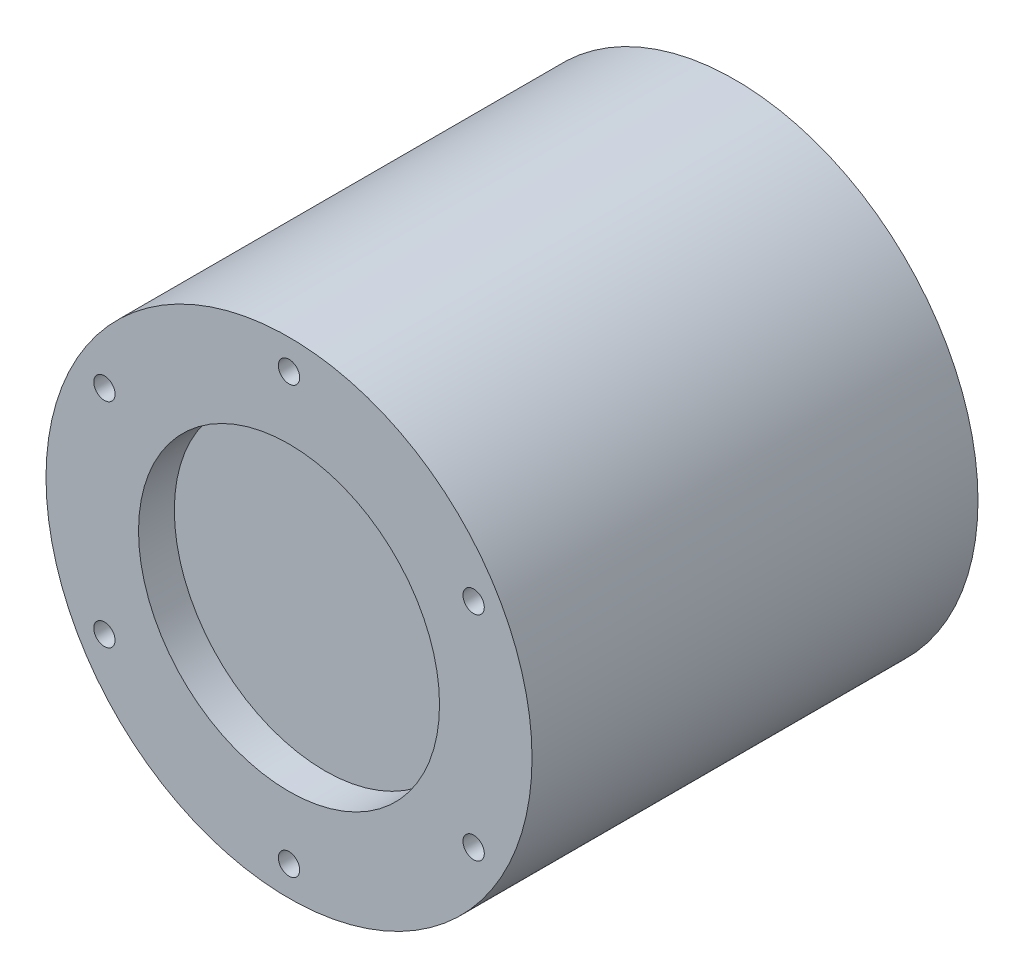
ISO-10303-21;
HEADER;
FILE_DESCRIPTION(('STEP AP214'),'2;1');
FILE_NAME('part.step','',(''),(''),'','','');
FILE_SCHEMA(('AUTOMOTIVE_DESIGN { 1 0 10303 214 1 1 1 1 }'));
ENDSEC;
DATA;
#1=APPLICATION_CONTEXT('core data for automotive mechanical design processes');
#2=APPLICATION_PROTOCOL_DEFINITION('international standard','automotive_design',2000,#1);
#3=PRODUCT_CONTEXT('',#1,'mechanical');
#4=PRODUCT('Part','Part','',(#3));
#5=PRODUCT_RELATED_PRODUCT_CATEGORY('part','',(#4));
#6=PRODUCT_DEFINITION_FORMATION('','',#4);
#7=PRODUCT_DEFINITION_CONTEXT('part definition',#1,'design');
#8=PRODUCT_DEFINITION('design','',#6,#7);
#9=PRODUCT_DEFINITION_SHAPE('','',#8);
#10=(LENGTH_UNIT() NAMED_UNIT(*) SI_UNIT(.MILLI.,.METRE.));
#11=(NAMED_UNIT(*) PLANE_ANGLE_UNIT() SI_UNIT($,.RADIAN.));
#12=(NAMED_UNIT(*) SI_UNIT($,.STERADIAN.) SOLID_ANGLE_UNIT());
#13=UNCERTAINTY_MEASURE_WITH_UNIT(LENGTH_MEASURE(1.E-05),#10,'distance_accuracy_value','');
#14=(GEOMETRIC_REPRESENTATION_CONTEXT(3) GLOBAL_UNCERTAINTY_ASSIGNED_CONTEXT((#13)) GLOBAL_UNIT_ASSIGNED_CONTEXT((#10,
#11,#12)) REPRESENTATION_CONTEXT('',''));
#15=CARTESIAN_POINT('',(0.,0.,0.));
#16=DIRECTION('',(0.,0.,1.));
#17=DIRECTION('',(1.,0.,0.));
#18=AXIS2_PLACEMENT_3D('',#15,#16,#17);
#19=CARTESIAN_POINT('',(0.,0.,-1.));
#20=DIRECTION('',(0.,0.,1.));
#21=DIRECTION('',(1.,0.,0.));
#22=AXIS2_PLACEMENT_3D('',#19,#20,#21);
#23=PLANE('',#22);
#24=CARTESIAN_POINT('',(0.,0.,-1.));
#25=DIRECTION('',(0.,0.,1.));
#26=DIRECTION('',(1.,0.,0.));
#27=AXIS2_PLACEMENT_3D('',#24,#25,#26);
#28=CIRCLE('',#27,17.65);
#29=CARTESIAN_POINT('',(-17.65,0.,-1.));
#30=VERTEX_POINT('',#29);
#31=EDGE_CURVE('E45',#30,#30,#28,.F.);
#32=ORIENTED_EDGE('',*,*,#31,.T.);
#33=EDGE_LOOP('',(#32));
#34=FACE_BOUND('',#33,.T.);
#35=CARTESIAN_POINT('',(0.,-25.,-1.));
#36=DIRECTION('',(0.,0.,1.));
#37=DIRECTION('',(1.,0.,0.));
#38=AXIS2_PLACEMENT_3D('',#35,#36,#37);
#39=CIRCLE('',#38,1.25);
#40=CARTESIAN_POINT('',(1.25,-25.,-1.));
#41=VERTEX_POINT('',#40);
#42=EDGE_CURVE('E77',#41,#41,#39,.T.);
#43=ORIENTED_EDGE('',*,*,#42,.F.);
#44=EDGE_LOOP('',(#43));
#45=FACE_BOUND('',#44,.T.);
#46=CARTESIAN_POINT('',(-21.650635094611,12.5,-1.));
#47=DIRECTION('',(0.,0.,1.));
#48=DIRECTION('',(1.,0.,0.));
#49=AXIS2_PLACEMENT_3D('',#46,#47,#48);
#50=CIRCLE('',#49,1.25);
#51=CARTESIAN_POINT('',(-20.400635094611,12.5,-1.));
#52=VERTEX_POINT('',#51);
#53=EDGE_CURVE('E65',#52,#52,#50,.T.);
#54=ORIENTED_EDGE('',*,*,#53,.F.);
#55=EDGE_LOOP('',(#54));
#56=FACE_BOUND('',#55,.T.);
#57=CARTESIAN_POINT('',(21.650635094611,12.5,-1.));
#58=DIRECTION('',(0.,0.,1.));
#59=DIRECTION('',(1.,0.,0.));
#60=AXIS2_PLACEMENT_3D('',#57,#58,#59);
#61=CIRCLE('',#60,1.25);
#62=CARTESIAN_POINT('',(22.900635094611,12.5,-1.));
#63=VERTEX_POINT('',#62);
#64=EDGE_CURVE('E54',#63,#63,#61,.T.);
#65=ORIENTED_EDGE('',*,*,#64,.F.);
#66=EDGE_LOOP('',(#65));
#67=FACE_BOUND('',#66,.T.);
#68=CARTESIAN_POINT('',(0.,0.,-1.));
#69=DIRECTION('',(0.,0.,1.));
#70=DIRECTION('',(1.,0.,0.));
#71=AXIS2_PLACEMENT_3D('',#68,#69,#70);
#72=CIRCLE('',#71,28.5);
#73=CARTESIAN_POINT('',(28.5,0.,-1.));
#74=VERTEX_POINT('',#73);
#75=EDGE_CURVE('E10',#74,#74,#72,.T.);
#76=ORIENTED_EDGE('',*,*,#75,.T.);
#77=EDGE_LOOP('',(#76));
#78=FACE_BOUND('',#77,.T.);
#79=CARTESIAN_POINT('',(0.,25.,-1.));
#80=DIRECTION('',(0.,0.,1.));
#81=DIRECTION('',(1.,0.,0.));
#82=AXIS2_PLACEMENT_3D('',#79,#80,#81);
#83=CIRCLE('',#82,1.25);
#84=CARTESIAN_POINT('',(1.25,25.,-1.));
#85=VERTEX_POINT('',#84);
#86=EDGE_CURVE('E59',#85,#85,#83,.T.);
#87=ORIENTED_EDGE('',*,*,#86,.F.);
#88=EDGE_LOOP('',(#87));
#89=FACE_BOUND('',#88,.T.);
#90=CARTESIAN_POINT('',(-21.650635094611,-12.5,-1.));
#91=DIRECTION('',(0.,0.,1.));
#92=DIRECTION('',(1.,0.,0.));
#93=AXIS2_PLACEMENT_3D('',#90,#91,#92);
#94=CIRCLE('',#93,1.25);
#95=CARTESIAN_POINT('',(-20.400635094611,-12.5,-1.));
#96=VERTEX_POINT('',#95);
#97=EDGE_CURVE('E71',#96,#96,#94,.T.);
#98=ORIENTED_EDGE('',*,*,#97,.F.);
#99=EDGE_LOOP('',(#98));
#100=FACE_BOUND('',#99,.T.);
#101=CARTESIAN_POINT('',(21.650635094611,-12.5,-1.));
#102=DIRECTION('',(0.,0.,1.));
#103=DIRECTION('',(1.,0.,0.));
#104=AXIS2_PLACEMENT_3D('',#101,#102,#103);
#105=CIRCLE('',#104,1.25);
#106=CARTESIAN_POINT('',(22.900635094611,-12.5,-1.));
#107=VERTEX_POINT('',#106);
#108=EDGE_CURVE('E83',#107,#107,#105,.T.);
#109=ORIENTED_EDGE('',*,*,#108,.F.);
#110=EDGE_LOOP('',(#109));
#111=FACE_BOUND('',#110,.T.);
#112=ADVANCED_FACE('F41',(#34,#45,#56,#67,#78,#89,#100,#111),#23,.T.);
#113=CARTESIAN_POINT('',(0.,0.,-53.3));
#114=DIRECTION('',(0.,0.,1.));
#115=DIRECTION('',(1.,0.,0.));
#116=AXIS2_PLACEMENT_3D('',#113,#114,#115);
#117=PLANE('',#116);
#118=CARTESIAN_POINT('',(0.,0.,-53.3));
#119=DIRECTION('',(0.,0.,1.));
#120=DIRECTION('',(1.,0.,0.));
#121=AXIS2_PLACEMENT_3D('',#118,#119,#120);
#122=CIRCLE('',#121,28.5);
#123=CARTESIAN_POINT('',(28.5,0.,-53.3));
#124=VERTEX_POINT('',#123);
#125=EDGE_CURVE('E49',#124,#124,#122,.T.);
#126=ORIENTED_EDGE('',*,*,#125,.F.);
#127=EDGE_LOOP('',(#126));
#128=FACE_BOUND('',#127,.T.);
#129=CARTESIAN_POINT('',(21.650635094611,12.5,-53.3));
#130=DIRECTION('',(0.,0.,1.));
#131=DIRECTION('',(1.,0.,0.));
#132=AXIS2_PLACEMENT_3D('',#129,#130,#131);
#133=CIRCLE('',#132,1.25);
#134=CARTESIAN_POINT('',(22.900635094611,12.5,-53.3));
#135=VERTEX_POINT('',#134);
#136=EDGE_CURVE('E56',#135,#135,#133,.T.);
#137=ORIENTED_EDGE('',*,*,#136,.T.);
#138=EDGE_LOOP('',(#137));
#139=FACE_BOUND('',#138,.T.);
#140=CARTESIAN_POINT('',(0.,25.,-53.3));
#141=DIRECTION('',(0.,0.,1.));
#142=DIRECTION('',(1.,0.,0.));
#143=AXIS2_PLACEMENT_3D('',#140,#141,#142);
#144=CIRCLE('',#143,1.25);
#145=CARTESIAN_POINT('',(1.25,25.,-53.3));
#146=VERTEX_POINT('',#145);
#147=EDGE_CURVE('E62',#146,#146,#144,.T.);
#148=ORIENTED_EDGE('',*,*,#147,.T.);
#149=EDGE_LOOP('',(#148));
#150=FACE_BOUND('',#149,.T.);
#151=CARTESIAN_POINT('',(-21.650635094611,12.5,-53.3));
#152=DIRECTION('',(0.,0.,1.));
#153=DIRECTION('',(1.,0.,0.));
#154=AXIS2_PLACEMENT_3D('',#151,#152,#153);
#155=CIRCLE('',#154,1.25);
#156=CARTESIAN_POINT('',(-20.400635094611,12.5,-53.3));
#157=VERTEX_POINT('',#156);
#158=EDGE_CURVE('E68',#157,#157,#155,.T.);
#159=ORIENTED_EDGE('',*,*,#158,.T.);
#160=EDGE_LOOP('',(#159));
#161=FACE_BOUND('',#160,.T.);
#162=CARTESIAN_POINT('',(-21.650635094611,-12.5,-53.3));
#163=DIRECTION('',(0.,0.,1.));
#164=DIRECTION('',(1.,0.,0.));
#165=AXIS2_PLACEMENT_3D('',#162,#163,#164);
#166=CIRCLE('',#165,1.25);
#167=CARTESIAN_POINT('',(-20.400635094611,-12.5,-53.3));
#168=VERTEX_POINT('',#167);
#169=EDGE_CURVE('E74',#168,#168,#166,.T.);
#170=ORIENTED_EDGE('',*,*,#169,.T.);
#171=EDGE_LOOP('',(#170));
#172=FACE_BOUND('',#171,.T.);
#173=CARTESIAN_POINT('',(0.,-25.,-53.3));
#174=DIRECTION('',(0.,0.,1.));
#175=DIRECTION('',(1.,0.,0.));
#176=AXIS2_PLACEMENT_3D('',#173,#174,#175);
#177=CIRCLE('',#176,1.25);
#178=CARTESIAN_POINT('',(1.25,-25.,-53.3));
#179=VERTEX_POINT('',#178);
#180=EDGE_CURVE('E80',#179,#179,#177,.T.);
#181=ORIENTED_EDGE('',*,*,#180,.T.);
#182=EDGE_LOOP('',(#181));
#183=FACE_BOUND('',#182,.T.);
#184=CARTESIAN_POINT('',(21.650635094611,-12.5,-53.3));
#185=DIRECTION('',(0.,0.,1.));
#186=DIRECTION('',(1.,0.,0.));
#187=AXIS2_PLACEMENT_3D('',#184,#185,#186);
#188=CIRCLE('',#187,1.25);
#189=CARTESIAN_POINT('',(22.900635094611,-12.5,-53.3));
#190=VERTEX_POINT('',#189);
#191=EDGE_CURVE('E86',#190,#190,#188,.T.);
#192=ORIENTED_EDGE('',*,*,#191,.T.);
#193=EDGE_LOOP('',(#192));
#194=FACE_BOUND('',#193,.T.);
#195=ADVANCED_FACE('F115',(#128,#139,#150,#161,#172,#183,#194),#117,.F.);
#196=CARTESIAN_POINT('',(0.,0.,-1.));
#197=DIRECTION('',(0.,0.,-1.));
#198=DIRECTION('',(-1.,0.,0.));
#199=AXIS2_PLACEMENT_3D('',#196,#197,#198);
#200=CYLINDRICAL_SURFACE('',#199,28.5);
#201=ORIENTED_EDGE('',*,*,#75,.F.);
#202=EDGE_LOOP('',(#201));
#203=FACE_BOUND('',#202,.T.);
#204=ORIENTED_EDGE('',*,*,#125,.T.);
#205=EDGE_LOOP('',(#204));
#206=FACE_BOUND('',#205,.T.);
#207=ADVANCED_FACE('F43',(#203,#206),#200,.T.);
#208=CARTESIAN_POINT('',(21.650635094611,12.5,-1.));
#209=DIRECTION('',(0.,0.,-1.));
#210=DIRECTION('',(-1.,0.,0.));
#211=AXIS2_PLACEMENT_3D('',#208,#209,#210);
#212=CYLINDRICAL_SURFACE('',#211,1.25);
#213=ORIENTED_EDGE('',*,*,#64,.T.);
#214=EDGE_LOOP('',(#213));
#215=FACE_BOUND('',#214,.T.);
#216=ORIENTED_EDGE('',*,*,#136,.F.);
#217=EDGE_LOOP('',(#216));
#218=FACE_BOUND('',#217,.T.);
#219=ADVANCED_FACE('F122',(#215,#218),#212,.F.);
#220=CARTESIAN_POINT('',(0.,25.,-1.));
#221=DIRECTION('',(0.,0.,-1.));
#222=DIRECTION('',(-1.,0.,0.));
#223=AXIS2_PLACEMENT_3D('',#220,#221,#222);
#224=CYLINDRICAL_SURFACE('',#223,1.25);
#225=ORIENTED_EDGE('',*,*,#86,.T.);
#226=EDGE_LOOP('',(#225));
#227=FACE_BOUND('',#226,.T.);
#228=ORIENTED_EDGE('',*,*,#147,.F.);
#229=EDGE_LOOP('',(#228));
#230=FACE_BOUND('',#229,.T.);
#231=ADVANCED_FACE('F125',(#227,#230),#224,.F.);
#232=CARTESIAN_POINT('',(-21.650635094611,12.5,-1.));
#233=DIRECTION('',(0.,0.,-1.));
#234=DIRECTION('',(-1.,0.,0.));
#235=AXIS2_PLACEMENT_3D('',#232,#233,#234);
#236=CYLINDRICAL_SURFACE('',#235,1.25);
#237=ORIENTED_EDGE('',*,*,#53,.T.);
#238=EDGE_LOOP('',(#237));
#239=FACE_BOUND('',#238,.T.);
#240=ORIENTED_EDGE('',*,*,#158,.F.);
#241=EDGE_LOOP('',(#240));
#242=FACE_BOUND('',#241,.T.);
#243=ADVANCED_FACE('F129',(#239,#242),#236,.F.);
#244=CARTESIAN_POINT('',(-21.650635094611,-12.5,-1.));
#245=DIRECTION('',(0.,0.,-1.));
#246=DIRECTION('',(-1.,0.,0.));
#247=AXIS2_PLACEMENT_3D('',#244,#245,#246);
#248=CYLINDRICAL_SURFACE('',#247,1.25);
#249=ORIENTED_EDGE('',*,*,#97,.T.);
#250=EDGE_LOOP('',(#249));
#251=FACE_BOUND('',#250,.T.);
#252=ORIENTED_EDGE('',*,*,#169,.F.);
#253=EDGE_LOOP('',(#252));
#254=FACE_BOUND('',#253,.T.);
#255=ADVANCED_FACE('F133',(#251,#254),#248,.F.);
#256=CARTESIAN_POINT('',(0.,-25.,-1.));
#257=DIRECTION('',(0.,0.,-1.));
#258=DIRECTION('',(-1.,0.,0.));
#259=AXIS2_PLACEMENT_3D('',#256,#257,#258);
#260=CYLINDRICAL_SURFACE('',#259,1.25);
#261=ORIENTED_EDGE('',*,*,#42,.T.);
#262=EDGE_LOOP('',(#261));
#263=FACE_BOUND('',#262,.T.);
#264=ORIENTED_EDGE('',*,*,#180,.F.);
#265=EDGE_LOOP('',(#264));
#266=FACE_BOUND('',#265,.T.);
#267=ADVANCED_FACE('F112',(#263,#266),#260,.F.);
#268=CARTESIAN_POINT('',(21.650635094611,-12.5,-1.));
#269=DIRECTION('',(0.,0.,-1.));
#270=DIRECTION('',(-1.,0.,0.));
#271=AXIS2_PLACEMENT_3D('',#268,#269,#270);
#272=CYLINDRICAL_SURFACE('',#271,1.25);
#273=ORIENTED_EDGE('',*,*,#108,.T.);
#274=EDGE_LOOP('',(#273));
#275=FACE_BOUND('',#274,.T.);
#276=ORIENTED_EDGE('',*,*,#191,.F.);
#277=EDGE_LOOP('',(#276));
#278=FACE_BOUND('',#277,.T.);
#279=ADVANCED_FACE('F104',(#275,#278),#272,.F.);
#280=CARTESIAN_POINT('',(0.,0.,-0.9));
#281=DIRECTION('',(0.,0.,-1.));
#282=DIRECTION('',(-1.,0.,0.));
#283=AXIS2_PLACEMENT_3D('',#280,#281,#282);
#284=CYLINDRICAL_SURFACE('',#283,17.65);
#285=CARTESIAN_POINT('',(0.,0.,-5.2));
#286=DIRECTION('',(0.,0.,1.));
#287=DIRECTION('',(1.,0.,0.));
#288=AXIS2_PLACEMENT_3D('',#285,#286,#287);
#289=CIRCLE('',#288,17.65);
#290=CARTESIAN_POINT('',(-17.65,0.,-5.2));
#291=VERTEX_POINT('',#290);
#292=EDGE_CURVE('E91',#291,#291,#289,.T.);
#293=CARTESIAN_POINT('',(-17.65,0.,-1.));
#294=CARTESIAN_POINT('',(-17.65,0.,-1.04375));
#295=CARTESIAN_POINT('',(-17.65,0.,-1.0875));
#296=CARTESIAN_POINT('',(-17.65,0.,-1.175));
#297=CARTESIAN_POINT('',(-17.65,0.,-1.21875));
#298=CARTESIAN_POINT('',(-17.65,0.,-1.30625));
#299=CARTESIAN_POINT('',(-17.65,0.,-1.35));
#300=CARTESIAN_POINT('',(-17.65,0.,-1.4375));
#301=CARTESIAN_POINT('',(-17.65,0.,-1.48125));
#302=CARTESIAN_POINT('',(-17.65,0.,-1.56875));
#303=CARTESIAN_POINT('',(-17.65,0.,-1.6125));
#304=CARTESIAN_POINT('',(-17.65,0.,-1.7));
#305=CARTESIAN_POINT('',(-17.65,0.,-1.74375));
#306=CARTESIAN_POINT('',(-17.65,0.,-1.83125));
#307=CARTESIAN_POINT('',(-17.65,0.,-1.875));
#308=CARTESIAN_POINT('',(-17.65,0.,-1.9625));
#309=CARTESIAN_POINT('',(-17.65,0.,-2.00625));
#310=CARTESIAN_POINT('',(-17.65,0.,-2.09375));
#311=CARTESIAN_POINT('',(-17.65,0.,-2.1375));
#312=CARTESIAN_POINT('',(-17.65,0.,-2.225));
#313=CARTESIAN_POINT('',(-17.65,0.,-2.26875));
#314=CARTESIAN_POINT('',(-17.65,0.,-2.35625));
#315=CARTESIAN_POINT('',(-17.65,0.,-2.4));
#316=CARTESIAN_POINT('',(-17.65,0.,-2.4875));
#317=CARTESIAN_POINT('',(-17.65,0.,-2.53125));
#318=CARTESIAN_POINT('',(-17.65,0.,-2.61875));
#319=CARTESIAN_POINT('',(-17.65,0.,-2.6625));
#320=CARTESIAN_POINT('',(-17.65,0.,-2.75));
#321=CARTESIAN_POINT('',(-17.65,0.,-2.79375));
#322=CARTESIAN_POINT('',(-17.65,0.,-2.88125));
#323=CARTESIAN_POINT('',(-17.65,0.,-2.925));
#324=CARTESIAN_POINT('',(-17.65,0.,-3.0125));
#325=CARTESIAN_POINT('',(-17.65,0.,-3.05625));
#326=CARTESIAN_POINT('',(-17.65,0.,-3.14375));
#327=CARTESIAN_POINT('',(-17.65,0.,-3.1875));
#328=CARTESIAN_POINT('',(-17.65,0.,-3.275));
#329=CARTESIAN_POINT('',(-17.65,0.,-3.31875));
#330=CARTESIAN_POINT('',(-17.65,0.,-3.40625));
#331=CARTESIAN_POINT('',(-17.65,0.,-3.45));
#332=CARTESIAN_POINT('',(-17.65,0.,-3.5375));
#333=CARTESIAN_POINT('',(-17.65,0.,-3.58125));
#334=CARTESIAN_POINT('',(-17.65,0.,-3.66875));
#335=CARTESIAN_POINT('',(-17.65,0.,-3.7125));
#336=CARTESIAN_POINT('',(-17.65,0.,-3.8));
#337=CARTESIAN_POINT('',(-17.65,0.,-3.84375));
#338=CARTESIAN_POINT('',(-17.65,0.,-3.93125));
#339=CARTESIAN_POINT('',(-17.65,0.,-3.975));
#340=CARTESIAN_POINT('',(-17.65,0.,-4.0625));
#341=CARTESIAN_POINT('',(-17.65,0.,-4.10625));
#342=CARTESIAN_POINT('',(-17.65,0.,-4.19375));
#343=CARTESIAN_POINT('',(-17.65,0.,-4.2375));
#344=CARTESIAN_POINT('',(-17.65,0.,-4.325));
#345=CARTESIAN_POINT('',(-17.65,0.,-4.36875));
#346=CARTESIAN_POINT('',(-17.65,0.,-4.45625));
#347=CARTESIAN_POINT('',(-17.65,0.,-4.5));
#348=CARTESIAN_POINT('',(-17.65,0.,-4.5875));
#349=CARTESIAN_POINT('',(-17.65,0.,-4.63125));
#350=CARTESIAN_POINT('',(-17.65,0.,-4.71875));
#351=CARTESIAN_POINT('',(-17.65,0.,-4.7625));
#352=CARTESIAN_POINT('',(-17.65,0.,-4.85));
#353=CARTESIAN_POINT('',(-17.65,0.,-4.89375));
#354=CARTESIAN_POINT('',(-17.65,0.,-4.98125));
#355=CARTESIAN_POINT('',(-17.65,0.,-5.025));
#356=CARTESIAN_POINT('',(-17.65,0.,-5.1125));
#357=CARTESIAN_POINT('',(-17.65,0.,-5.15625));
#358=CARTESIAN_POINT('',(-17.65,0.,-5.2));
#359=B_SPLINE_CURVE_WITH_KNOTS('',3,(#293,#294,#295,#296,#297,#298,#299,#300,#301,#302,#303,
#304,#305,#306,#307,#308,#309,#310,#311,#312,#313,#314,#315,#316,#317,#318,#319,#320,#321,#322,
#323,#324,#325,#326,#327,#328,#329,#330,#331,#332,#333,#334,#335,#336,#337,#338,#339,#340,#341,
#342,#343,#344,#345,#346,#347,#348,#349,#350,#351,#352,#353,#354,#355,#356,#357,#358),
.UNSPECIFIED.,.F.,.F.,(4,2,2,2,2,2,2,2,2,2,2,2,2,2,2,2,2,2,2,2,2,2,2,2,2,2,2,2,2,2,2,2,4),(0.,
0.13125,0.2625,0.39375,0.525,0.65625,0.7875,0.91875,1.05,1.18125,1.3125,1.44375,1.575,1.70625,
1.8375,1.96875,2.1,2.23125,2.3625,2.49375,2.625,2.75625,2.8875,3.01875,3.15,3.28125,3.4125,
3.54375,3.675,3.80625,3.9375,4.06875,4.2),.UNSPECIFIED.);
#360=EDGE_CURVE('BSEAM100',#30,#291,#359,.T.);
#361=ORIENTED_EDGE('',*,*,#31,.F.);
#362=ORIENTED_EDGE('',*,*,#292,.F.);
#363=ORIENTED_EDGE('',*,*,#360,.T.);
#364=ORIENTED_EDGE('',*,*,#360,.F.);
#365=EDGE_LOOP('',(#361,#363,#362,#364));
#366=FACE_BOUND('',#365,.T.);
#367=ADVANCED_FACE('F100',(#366),#284,.F.);
#368=CARTESIAN_POINT('',(0.,0.,-5.2));
#369=DIRECTION('',(0.,0.,1.));
#370=DIRECTION('',(1.,0.,0.));
#371=AXIS2_PLACEMENT_3D('',#368,#369,#370);
#372=PLANE('',#371);
#373=ORIENTED_EDGE('',*,*,#292,.T.);
#374=EDGE_LOOP('',(#373));
#375=FACE_BOUND('',#374,.T.);
#376=ADVANCED_FACE('F103',(#375),#372,.T.);
#377=CLOSED_SHELL('',(#112,#195,#207,#219,#231,#243,#255,#267,#279,#367,#376));
#378=MANIFOLD_SOLID_BREP('B2',#377);
#379=ADVANCED_BREP_SHAPE_REPRESENTATION('',(#18,#378),#14);
#380=SHAPE_DEFINITION_REPRESENTATION(#9,#379);
ENDSEC;
END-ISO-10303-21;
